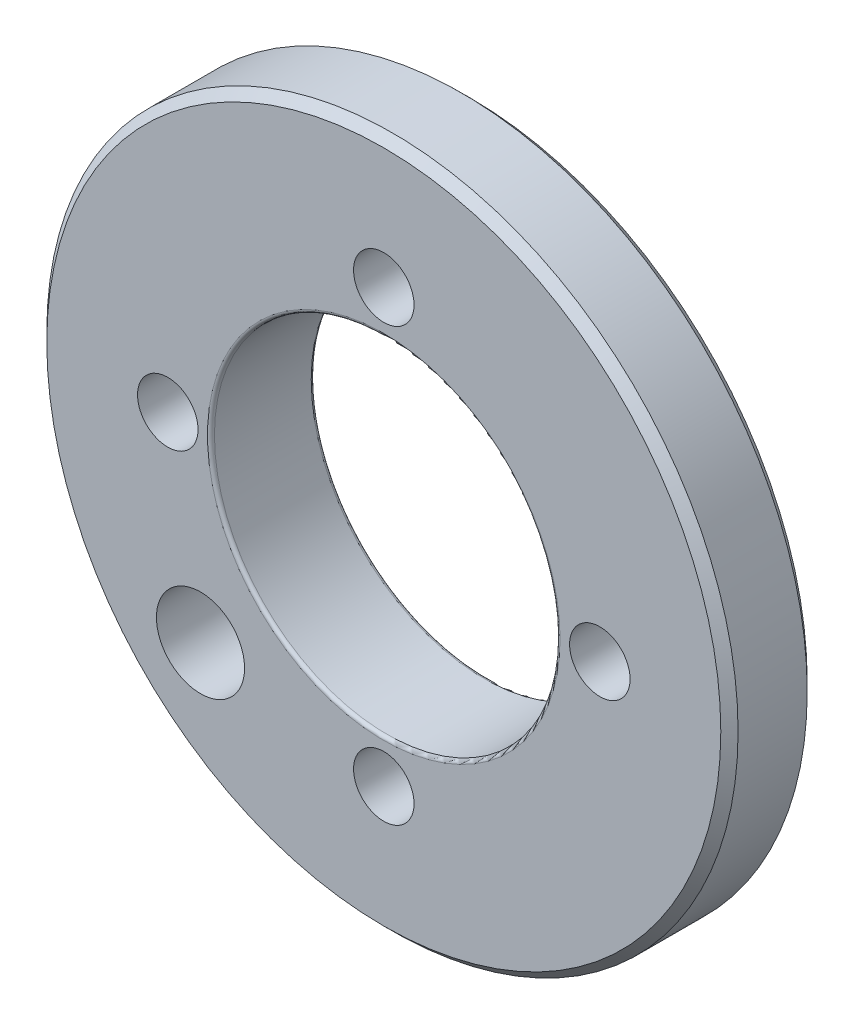
ISO-10303-21;
HEADER;
FILE_DESCRIPTION(('STEP AP214'),'2;1');
FILE_NAME('part.step','',(''),(''),'','','');
FILE_SCHEMA(('AUTOMOTIVE_DESIGN { 1 0 10303 214 1 1 1 1 }'));
ENDSEC;
DATA;
#1=APPLICATION_CONTEXT('core data for automotive mechanical design processes');
#2=APPLICATION_PROTOCOL_DEFINITION('international standard','automotive_design',2000,#1);
#3=PRODUCT_CONTEXT('',#1,'mechanical');
#4=PRODUCT('Part','Part','',(#3));
#5=PRODUCT_RELATED_PRODUCT_CATEGORY('part','',(#4));
#6=PRODUCT_DEFINITION_FORMATION('','',#4);
#7=PRODUCT_DEFINITION_CONTEXT('part definition',#1,'design');
#8=PRODUCT_DEFINITION('design','',#6,#7);
#9=PRODUCT_DEFINITION_SHAPE('','',#8);
#10=(LENGTH_UNIT() NAMED_UNIT(*) SI_UNIT(.MILLI.,.METRE.));
#11=(NAMED_UNIT(*) PLANE_ANGLE_UNIT() SI_UNIT($,.RADIAN.));
#12=(NAMED_UNIT(*) SI_UNIT($,.STERADIAN.) SOLID_ANGLE_UNIT());
#13=UNCERTAINTY_MEASURE_WITH_UNIT(LENGTH_MEASURE(1.E-05),#10,'distance_accuracy_value','');
#14=(GEOMETRIC_REPRESENTATION_CONTEXT(3) GLOBAL_UNCERTAINTY_ASSIGNED_CONTEXT((#13)) GLOBAL_UNIT_ASSIGNED_CONTEXT((#10,
#11,#12)) REPRESENTATION_CONTEXT('',''));
#15=CARTESIAN_POINT('',(0.,0.,0.));
#16=DIRECTION('',(0.,0.,1.));
#17=DIRECTION('',(1.,0.,0.));
#18=AXIS2_PLACEMENT_3D('',#15,#16,#17);
#19=CARTESIAN_POINT('',(0.,0.,6.00000000000001));
#20=DIRECTION('',(0.,0.,-1.));
#21=DIRECTION('',(-1.00000000000001,0.,0.));
#22=AXIS2_PLACEMENT_3D('',#19,#20,#21);
#23=CYLINDRICAL_SURFACE('',#22,16.5);
#24=CARTESIAN_POINT('',(0.,0.,0.));
#25=DIRECTION('',(0.,0.,1.));
#26=DIRECTION('',(1.00000000000001,0.,0.));
#27=AXIS2_PLACEMENT_3D('',#24,#25,#26);
#28=CIRCLE('',#27,16.5);
#29=CARTESIAN_POINT('',(16.5000000000002,0.,0.));
#30=VERTEX_POINT('',#29);
#31=EDGE_CURVE('E83',#30,#30,#28,.T.);
#32=ORIENTED_EDGE('',*,*,#31,.T.);
#33=EDGE_LOOP('',(#32));
#34=FACE_BOUND('',#33,.T.);
#35=CARTESIAN_POINT('',(0.,0.,1.));
#36=DIRECTION('',(0.,0.,1.));
#37=DIRECTION('',(1.00000000000001,0.,0.));
#38=AXIS2_PLACEMENT_3D('',#35,#36,#37);
#39=CIRCLE('',#38,16.5);
#40=CARTESIAN_POINT('',(-13.0930794595227,-10.0409795471673,1.00000000000014));
#41=VERTEX_POINT('',#40);
#42=CARTESIAN_POINT('',(-10.0409795471672,-13.0930794595228,1.00000000000012));
#43=VERTEX_POINT('',#42);
#44=EDGE_CURVE('E69',#41,#43,#39,.T.);
#45=ORIENTED_EDGE('',*,*,#44,.F.);
#46=EDGE_CURVE('E80',#43,#41,#39,.T.);
#47=ORIENTED_EDGE('',*,*,#46,.F.);
#48=EDGE_LOOP('',(#45,#47));
#49=FACE_BOUND('',#48,.T.);
#50=ADVANCED_FACE('F49',(#34,#49),#23,.T.);
#51=CARTESIAN_POINT('',(12.5000000000002,0.,6.00000000000001));
#52=DIRECTION('',(0.,0.,-1.));
#53=DIRECTION('',(-1.00000000000001,0.,0.));
#54=AXIS2_PLACEMENT_3D('',#51,#52,#53);
#55=CYLINDRICAL_SURFACE('',#54,1.75);
#56=CARTESIAN_POINT('',(12.5000000000002,0.,6.00000000000001));
#57=DIRECTION('',(0.,0.,1.));
#58=DIRECTION('',(1.00000000000001,0.,0.));
#59=AXIS2_PLACEMENT_3D('',#56,#57,#58);
#60=CIRCLE('',#59,1.75);
#61=CARTESIAN_POINT('',(14.2500000000002,0.,6.00000000000001));
#62=VERTEX_POINT('',#61);
#63=EDGE_CURVE('E79',#62,#62,#60,.T.);
#64=ORIENTED_EDGE('',*,*,#63,.T.);
#65=EDGE_LOOP('',(#64));
#66=FACE_BOUND('',#65,.T.);
#67=CARTESIAN_POINT('',(12.5000000000002,0.,0.));
#68=DIRECTION('',(0.,0.,1.));
#69=DIRECTION('',(1.00000000000001,0.,0.));
#70=AXIS2_PLACEMENT_3D('',#67,#68,#69);
#71=CIRCLE('',#70,1.75);
#72=CARTESIAN_POINT('',(14.2500000000002,0.,0.));
#73=VERTEX_POINT('',#72);
#74=EDGE_CURVE('E108',#73,#73,#71,.T.);
#75=ORIENTED_EDGE('',*,*,#74,.F.);
#76=EDGE_LOOP('',(#75));
#77=FACE_BOUND('',#76,.T.);
#78=ADVANCED_FACE('F144',(#66,#77),#55,.F.);
#79=CARTESIAN_POINT('',(0.,0.,6.00000000000001));
#80=DIRECTION('',(0.,0.,1.));
#81=DIRECTION('',(1.00000000000001,0.,0.));
#82=AXIS2_PLACEMENT_3D('',#79,#80,#81);
#83=PLANE('',#82);
#84=CARTESIAN_POINT('',(0.,0.,6.00000000000001));
#85=DIRECTION('',(0.,0.,1.));
#86=DIRECTION('',(1.00000000000001,0.,0.));
#87=AXIS2_PLACEMENT_3D('',#84,#85,#86);
#88=CIRCLE('',#87,19.5);
#89=CARTESIAN_POINT('',(19.5000000000002,0.,6.00000000000001));
#90=VERTEX_POINT('',#89);
#91=EDGE_CURVE('E123',#90,#90,#88,.T.);
#92=ORIENTED_EDGE('',*,*,#91,.T.);
#93=EDGE_LOOP('',(#92));
#94=FACE_BOUND('',#93,.T.);
#95=CARTESIAN_POINT('',(0.,0.,6.00000000000001));
#96=DIRECTION('',(0.,0.,1.));
#97=DIRECTION('',(1.00000000000001,0.,0.));
#98=AXIS2_PLACEMENT_3D('',#95,#96,#97);
#99=CIRCLE('',#98,10.2);
#100=CARTESIAN_POINT('',(10.2000000000001,0.,6.00000000000001));
#101=VERTEX_POINT('',#100);
#102=EDGE_CURVE('E117',#101,#101,#99,.F.);
#103=ORIENTED_EDGE('',*,*,#102,.T.);
#104=EDGE_LOOP('',(#103));
#105=FACE_BOUND('',#104,.T.);
#106=CARTESIAN_POINT('',(-10.6066017177982,-10.6066017177983,6.00000000000001));
#107=DIRECTION('',(0.,0.,1.));
#108=DIRECTION('',(1.00000000000001,0.,0.));
#109=AXIS2_PLACEMENT_3D('',#106,#107,#108);
#110=CIRCLE('',#109,2.55);
#111=CARTESIAN_POINT('',(-8.05660171779821,-10.6066017177983,6.00000000000001));
#112=VERTEX_POINT('',#111);
#113=EDGE_CURVE('E72',#112,#112,#110,.T.);
#114=ORIENTED_EDGE('',*,*,#113,.F.);
#115=EDGE_LOOP('',(#114));
#116=FACE_BOUND('',#115,.T.);
#117=ORIENTED_EDGE('',*,*,#63,.F.);
#118=EDGE_LOOP('',(#117));
#119=FACE_BOUND('',#118,.T.);
#120=CARTESIAN_POINT('',(0.,12.5000000000002,6.00000000000001));
#121=DIRECTION('',(0.,0.,1.));
#122=DIRECTION('',(1.00000000000001,0.,0.));
#123=AXIS2_PLACEMENT_3D('',#120,#121,#122);
#124=CIRCLE('',#123,1.75);
#125=CARTESIAN_POINT('',(1.75000000000002,12.5000000000002,6.00000000000001));
#126=VERTEX_POINT('',#125);
#127=EDGE_CURVE('E92',#126,#126,#124,.T.);
#128=ORIENTED_EDGE('',*,*,#127,.F.);
#129=EDGE_LOOP('',(#128));
#130=FACE_BOUND('',#129,.T.);
#131=CARTESIAN_POINT('',(-12.5000000000001,0.,6.00000000000001));
#132=DIRECTION('',(0.,0.,1.));
#133=DIRECTION('',(1.00000000000001,0.,0.));
#134=AXIS2_PLACEMENT_3D('',#131,#132,#133);
#135=CIRCLE('',#134,1.75);
#136=CARTESIAN_POINT('',(-10.7500000000001,0.,6.00000000000001));
#137=VERTEX_POINT('',#136);
#138=EDGE_CURVE('E99',#137,#137,#135,.T.);
#139=ORIENTED_EDGE('',*,*,#138,.F.);
#140=EDGE_LOOP('',(#139));
#141=FACE_BOUND('',#140,.T.);
#142=CARTESIAN_POINT('',(0.,-12.5000000000002,6.00000000000001));
#143=DIRECTION('',(0.,0.,1.));
#144=DIRECTION('',(1.00000000000001,0.,0.));
#145=AXIS2_PLACEMENT_3D('',#142,#143,#144);
#146=CIRCLE('',#145,1.75);
#147=CARTESIAN_POINT('',(1.75000000000002,-12.5000000000002,6.00000000000001));
#148=VERTEX_POINT('',#147);
#149=EDGE_CURVE('E105',#148,#148,#146,.T.);
#150=ORIENTED_EDGE('',*,*,#149,.F.);
#151=EDGE_LOOP('',(#150));
#152=FACE_BOUND('',#151,.T.);
#153=ADVANCED_FACE('F140',(#94,#105,#116,#119,#130,#141,#152),#83,.T.);
#154=CARTESIAN_POINT('',(0.,0.,0.));
#155=DIRECTION('',(0.,0.,1.));
#156=DIRECTION('',(1.00000000000001,0.,0.));
#157=AXIS2_PLACEMENT_3D('',#154,#155,#156);
#158=PLANE('',#157);
#159=CARTESIAN_POINT('',(0.,0.,0.));
#160=DIRECTION('',(0.,0.,1.));
#161=DIRECTION('',(1.00000000000001,0.,0.));
#162=AXIS2_PLACEMENT_3D('',#159,#160,#161);
#163=CIRCLE('',#162,10.2);
#164=CARTESIAN_POINT('',(10.2000000000001,0.,0.));
#165=VERTEX_POINT('',#164);
#166=EDGE_CURVE('E120',#165,#165,#163,.T.);
#167=ORIENTED_EDGE('',*,*,#166,.T.);
#168=EDGE_LOOP('',(#167));
#169=FACE_BOUND('',#168,.T.);
#170=ORIENTED_EDGE('',*,*,#31,.F.);
#171=EDGE_LOOP('',(#170));
#172=FACE_BOUND('',#171,.T.);
#173=ORIENTED_EDGE('',*,*,#74,.T.);
#174=EDGE_LOOP('',(#173));
#175=FACE_BOUND('',#174,.T.);
#176=CARTESIAN_POINT('',(0.,-12.5000000000002,0.));
#177=DIRECTION('',(0.,0.,1.));
#178=DIRECTION('',(1.00000000000001,0.,0.));
#179=AXIS2_PLACEMENT_3D('',#176,#177,#178);
#180=CIRCLE('',#179,1.75);
#181=CARTESIAN_POINT('',(1.75000000000002,-12.5000000000002,0.));
#182=VERTEX_POINT('',#181);
#183=EDGE_CURVE('E102',#182,#182,#180,.T.);
#184=ORIENTED_EDGE('',*,*,#183,.T.);
#185=EDGE_LOOP('',(#184));
#186=FACE_BOUND('',#185,.T.);
#187=CARTESIAN_POINT('',(-12.5000000000001,0.,0.));
#188=DIRECTION('',(0.,0.,1.));
#189=DIRECTION('',(1.00000000000001,0.,0.));
#190=AXIS2_PLACEMENT_3D('',#187,#188,#189);
#191=CIRCLE('',#190,1.75);
#192=CARTESIAN_POINT('',(-10.7500000000001,0.,0.));
#193=VERTEX_POINT('',#192);
#194=EDGE_CURVE('E95',#193,#193,#191,.T.);
#195=ORIENTED_EDGE('',*,*,#194,.T.);
#196=EDGE_LOOP('',(#195));
#197=FACE_BOUND('',#196,.T.);
#198=CARTESIAN_POINT('',(0.,12.5000000000002,0.));
#199=DIRECTION('',(0.,0.,1.));
#200=DIRECTION('',(1.00000000000001,0.,0.));
#201=AXIS2_PLACEMENT_3D('',#198,#199,#200);
#202=CIRCLE('',#201,1.75);
#203=CARTESIAN_POINT('',(1.75000000000002,12.5000000000002,0.));
#204=VERTEX_POINT('',#203);
#205=EDGE_CURVE('E96',#204,#204,#202,.T.);
#206=ORIENTED_EDGE('',*,*,#205,.T.);
#207=EDGE_LOOP('',(#206));
#208=FACE_BOUND('',#207,.T.);
#209=ADVANCED_FACE('F143',(#169,#172,#175,#186,#197,#208),#158,.F.);
#210=CARTESIAN_POINT('',(0.,-12.5000000000002,6.00000000000001));
#211=DIRECTION('',(0.,0.,-1.));
#212=DIRECTION('',(-1.00000000000001,0.,0.));
#213=AXIS2_PLACEMENT_3D('',#210,#211,#212);
#214=CYLINDRICAL_SURFACE('',#213,1.75);
#215=ORIENTED_EDGE('',*,*,#149,.T.);
#216=EDGE_LOOP('',(#215));
#217=FACE_BOUND('',#216,.T.);
#218=ORIENTED_EDGE('',*,*,#183,.F.);
#219=EDGE_LOOP('',(#218));
#220=FACE_BOUND('',#219,.T.);
#221=ADVANCED_FACE('F160',(#217,#220),#214,.F.);
#222=CARTESIAN_POINT('',(-12.5000000000001,0.,6.00000000000001));
#223=DIRECTION('',(0.,0.,-1.));
#224=DIRECTION('',(-1.00000000000001,0.,0.));
#225=AXIS2_PLACEMENT_3D('',#222,#223,#224);
#226=CYLINDRICAL_SURFACE('',#225,1.75);
#227=ORIENTED_EDGE('',*,*,#138,.T.);
#228=EDGE_LOOP('',(#227));
#229=FACE_BOUND('',#228,.T.);
#230=ORIENTED_EDGE('',*,*,#194,.F.);
#231=EDGE_LOOP('',(#230));
#232=FACE_BOUND('',#231,.T.);
#233=ADVANCED_FACE('F163',(#229,#232),#226,.F.);
#234=CARTESIAN_POINT('',(0.,12.5000000000002,6.00000000000001));
#235=DIRECTION('',(0.,0.,-1.));
#236=DIRECTION('',(-1.00000000000001,0.,0.));
#237=AXIS2_PLACEMENT_3D('',#234,#235,#236);
#238=CYLINDRICAL_SURFACE('',#237,1.75);
#239=ORIENTED_EDGE('',*,*,#127,.T.);
#240=EDGE_LOOP('',(#239));
#241=FACE_BOUND('',#240,.T.);
#242=ORIENTED_EDGE('',*,*,#205,.F.);
#243=EDGE_LOOP('',(#242));
#244=FACE_BOUND('',#243,.T.);
#245=ADVANCED_FACE('F175',(#241,#244),#238,.F.);
#246=CARTESIAN_POINT('',(0.,0.,1.));
#247=DIRECTION('',(0.,0.,1.));
#248=DIRECTION('',(1.00000000000001,0.,0.));
#249=AXIS2_PLACEMENT_3D('',#246,#247,#248);
#250=CYLINDRICAL_SURFACE('',#249,20.);
#251=CARTESIAN_POINT('',(0.,0.,5.49999999999998));
#252=DIRECTION('',(0.,0.,1.));
#253=DIRECTION('',(1.00000000000001,0.,0.));
#254=AXIS2_PLACEMENT_3D('',#251,#252,#253);
#255=CIRCLE('',#254,20.);
#256=CARTESIAN_POINT('',(20.0000000000002,0.,5.49999999999998));
#257=VERTEX_POINT('',#256);
#258=EDGE_CURVE('E58',#257,#257,#255,.F.);
#259=ORIENTED_EDGE('',*,*,#258,.T.);
#260=EDGE_LOOP('',(#259));
#261=FACE_BOUND('',#260,.T.);
#262=CARTESIAN_POINT('',(0.,0.,1.5));
#263=DIRECTION('',(0.,0.,1.));
#264=DIRECTION('',(1.00000000000001,0.,0.));
#265=AXIS2_PLACEMENT_3D('',#262,#263,#264);
#266=CIRCLE('',#265,20.);
#267=CARTESIAN_POINT('',(20.0000000000002,0.,1.5));
#268=VERTEX_POINT('',#267);
#269=EDGE_CURVE('E126',#268,#268,#266,.T.);
#270=ORIENTED_EDGE('',*,*,#269,.T.);
#271=EDGE_LOOP('',(#270));
#272=FACE_BOUND('',#271,.T.);
#273=ADVANCED_FACE('F131',(#261,#272),#250,.T.);
#274=CARTESIAN_POINT('',(0.,0.,1.));
#275=DIRECTION('',(0.,0.,1.));
#276=DIRECTION('',(1.00000000000001,0.,0.));
#277=AXIS2_PLACEMENT_3D('',#274,#275,#276);
#278=PLANE('',#277);
#279=CARTESIAN_POINT('',(0.,0.,1.));
#280=DIRECTION('',(0.,0.,1.));
#281=DIRECTION('',(1.00000000000001,0.,0.));
#282=AXIS2_PLACEMENT_3D('',#279,#280,#281);
#283=CIRCLE('',#282,19.5);
#284=CARTESIAN_POINT('',(19.5000000000002,0.,1.));
#285=VERTEX_POINT('',#284);
#286=EDGE_CURVE('E11',#285,#285,#283,.F.);
#287=ORIENTED_EDGE('',*,*,#286,.T.);
#288=EDGE_LOOP('',(#287));
#289=FACE_BOUND('',#288,.T.);
#290=ORIENTED_EDGE('',*,*,#46,.T.);
#291=CARTESIAN_POINT('',(-10.6066017177982,-10.6066017177984,1.));
#292=DIRECTION('',(0.,0.,1.));
#293=DIRECTION('',(1.00000000000001,0.,0.));
#294=AXIS2_PLACEMENT_3D('',#291,#292,#293);
#295=CIRCLE('',#294,2.55);
#296=EDGE_CURVE('E71',#41,#43,#295,.T.);
#297=ORIENTED_EDGE('',*,*,#296,.T.);
#298=EDGE_LOOP('',(#290,#297));
#299=FACE_BOUND('',#298,.T.);
#300=ADVANCED_FACE('F81',(#289,#299),#278,.F.);
#301=CARTESIAN_POINT('',(-10.6066017177982,-10.6066017177984,1.));
#302=DIRECTION('',(0.,0.,1.));
#303=DIRECTION('',(1.00000000000001,0.,0.));
#304=AXIS2_PLACEMENT_3D('',#301,#302,#303);
#305=PLANE('',#304);
#306=ORIENTED_EDGE('',*,*,#44,.T.);
#307=EDGE_CURVE('E64',#43,#41,#295,.T.);
#308=ORIENTED_EDGE('',*,*,#307,.T.);
#309=EDGE_LOOP('',(#306,#308));
#310=FACE_BOUND('',#309,.T.);
#311=ADVANCED_FACE('F67',(#310),#305,.T.);
#312=CARTESIAN_POINT('',(-10.6066017177982,-10.6066017177984,1.));
#313=DIRECTION('',(0.,0.,1.));
#314=DIRECTION('',(1.00000000000001,0.,0.));
#315=AXIS2_PLACEMENT_3D('',#312,#313,#314);
#316=CYLINDRICAL_SURFACE('',#315,2.55);
#317=ORIENTED_EDGE('',*,*,#296,.F.);
#318=ORIENTED_EDGE('',*,*,#307,.F.);
#319=EDGE_LOOP('',(#317,#318));
#320=FACE_BOUND('',#319,.T.);
#321=ORIENTED_EDGE('',*,*,#113,.T.);
#322=EDGE_LOOP('',(#321));
#323=FACE_BOUND('',#322,.T.);
#324=ADVANCED_FACE('F75',(#320,#323),#316,.F.);
#325=CARTESIAN_POINT('',(0.,0.,0.));
#326=DIRECTION('',(0.,0.,1.));
#327=DIRECTION('',(1.00000000000001,0.,0.));
#328=AXIS2_PLACEMENT_3D('',#325,#326,#327);
#329=CYLINDRICAL_SURFACE('',#328,10.);
#330=CARTESIAN_POINT('',(0.,0.,5.8));
#331=DIRECTION('',(0.,0.,1.));
#332=DIRECTION('',(1.00000000000001,0.,0.));
#333=AXIS2_PLACEMENT_3D('',#330,#331,#332);
#334=CIRCLE('',#333,10.);
#335=CARTESIAN_POINT('',(10.0000000000001,0.,5.8));
#336=VERTEX_POINT('',#335);
#337=EDGE_CURVE('E87',#336,#336,#334,.T.);
#338=ORIENTED_EDGE('',*,*,#337,.T.);
#339=EDGE_LOOP('',(#338));
#340=FACE_BOUND('',#339,.T.);
#341=CARTESIAN_POINT('',(0.,0.,0.200000000000006));
#342=DIRECTION('',(0.,0.,1.));
#343=DIRECTION('',(1.00000000000001,0.,0.));
#344=AXIS2_PLACEMENT_3D('',#341,#342,#343);
#345=CIRCLE('',#344,10.);
#346=CARTESIAN_POINT('',(10.0000000000001,0.,0.200000000000006));
#347=VERTEX_POINT('',#346);
#348=EDGE_CURVE('E85',#347,#347,#345,.F.);
#349=ORIENTED_EDGE('',*,*,#348,.T.);
#350=EDGE_LOOP('',(#349));
#351=FACE_BOUND('',#350,.T.);
#352=ADVANCED_FACE('F198',(#340,#351),#329,.F.);
#353=CARTESIAN_POINT('',(0.,0.,5.8));
#354=DIRECTION('',(0.,0.,1.));
#355=DIRECTION('',(1.00000000000001,0.,0.));
#356=AXIS2_PLACEMENT_3D('',#353,#354,#355);
#357=TOROIDAL_SURFACE('',#356,10.2,0.2);
#358=ORIENTED_EDGE('',*,*,#102,.F.);
#359=EDGE_LOOP('',(#358));
#360=FACE_BOUND('',#359,.T.);
#361=ORIENTED_EDGE('',*,*,#337,.F.);
#362=EDGE_LOOP('',(#361));
#363=FACE_BOUND('',#362,.T.);
#364=ADVANCED_FACE('F195',(#360,#363),#357,.T.);
#365=CARTESIAN_POINT('',(0.,0.,0.200000000000006));
#366=DIRECTION('',(0.,0.,1.));
#367=DIRECTION('',(1.00000000000001,0.,0.));
#368=AXIS2_PLACEMENT_3D('',#365,#366,#367);
#369=TOROIDAL_SURFACE('',#368,10.2,0.2);
#370=ORIENTED_EDGE('',*,*,#348,.F.);
#371=EDGE_LOOP('',(#370));
#372=FACE_BOUND('',#371,.T.);
#373=ORIENTED_EDGE('',*,*,#166,.F.);
#374=EDGE_LOOP('',(#373));
#375=FACE_BOUND('',#374,.T.);
#376=ADVANCED_FACE('F137',(#372,#375),#369,.T.);
#377=CARTESIAN_POINT('',(0.,0.,6.00000000000001));
#378=DIRECTION('',(0.,0.,-1.));
#379=DIRECTION('',(-1.00000000000001,0.,0.));
#380=AXIS2_PLACEMENT_3D('',#377,#378,#379);
#381=CONICAL_SURFACE('',#380,19.5,0.785398163397441);
#382=ORIENTED_EDGE('',*,*,#258,.F.);
#383=EDGE_LOOP('',(#382));
#384=FACE_BOUND('',#383,.T.);
#385=ORIENTED_EDGE('',*,*,#91,.F.);
#386=EDGE_LOOP('',(#385));
#387=FACE_BOUND('',#386,.T.);
#388=ADVANCED_FACE('F134',(#384,#387),#381,.T.);
#389=CARTESIAN_POINT('',(0.,0.,1.5));
#390=DIRECTION('',(0.,0.,1.));
#391=DIRECTION('',(1.00000000000001,0.,0.));
#392=AXIS2_PLACEMENT_3D('',#389,#390,#391);
#393=CONICAL_SURFACE('',#392,20.,0.785398163397452);
#394=ORIENTED_EDGE('',*,*,#286,.F.);
#395=EDGE_LOOP('',(#394));
#396=FACE_BOUND('',#395,.T.);
#397=ORIENTED_EDGE('',*,*,#269,.F.);
#398=EDGE_LOOP('',(#397));
#399=FACE_BOUND('',#398,.T.);
#400=ADVANCED_FACE('F52',(#396,#399),#393,.T.);
#401=CLOSED_SHELL('',(#50,#78,#153,#209,#221,#233,#245,#273,#300,#311,#324,#352,#364,#376,#388,#400));
#402=MANIFOLD_SOLID_BREP('B2',#401);
#403=ADVANCED_BREP_SHAPE_REPRESENTATION('',(#18,#402),#14);
#404=SHAPE_DEFINITION_REPRESENTATION(#9,#403);
ENDSEC;
END-ISO-10303-21;
